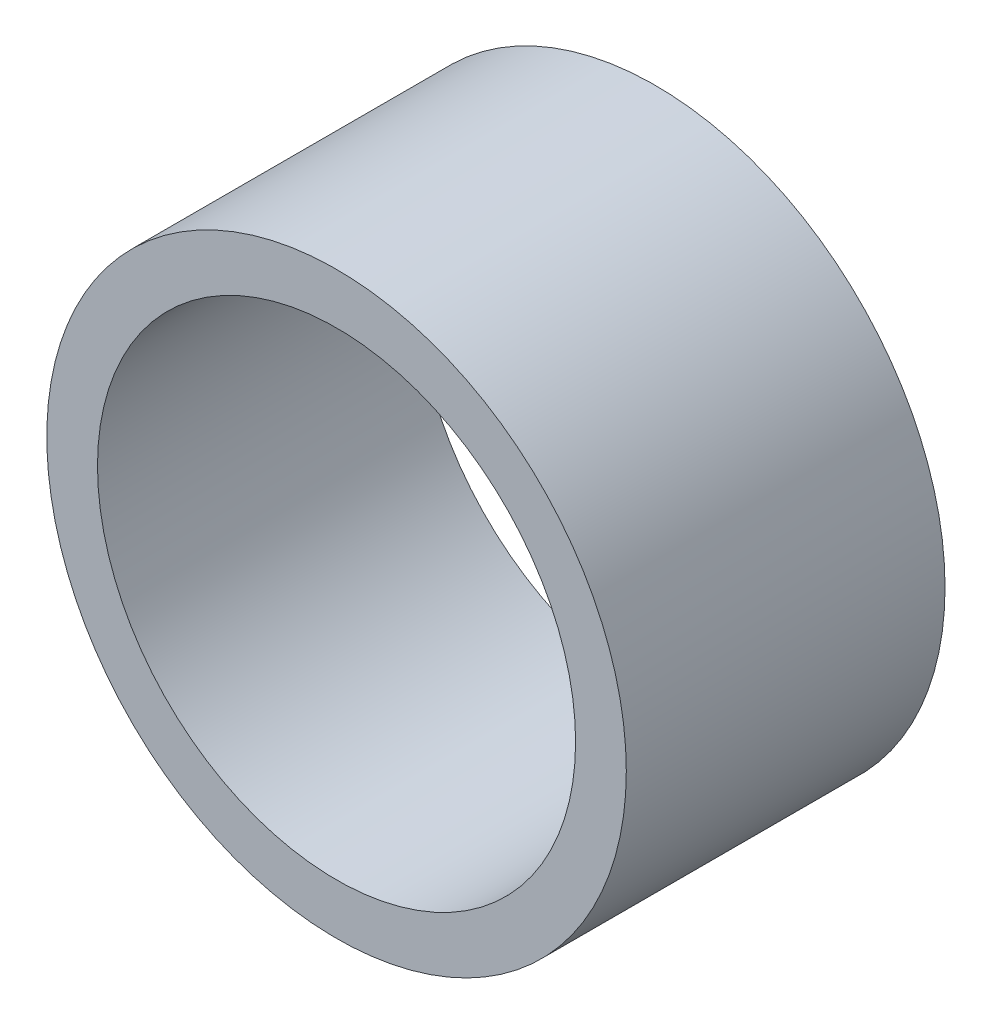
ISO-10303-21;
HEADER;
FILE_DESCRIPTION(('STEP AP214'),'2;1');
FILE_NAME('part.step','',(''),(''),'','','');
FILE_SCHEMA(('AUTOMOTIVE_DESIGN { 1 0 10303 214 1 1 1 1 }'));
ENDSEC;
DATA;
#1=APPLICATION_CONTEXT('core data for automotive mechanical design processes');
#2=APPLICATION_PROTOCOL_DEFINITION('international standard','automotive_design',2000,#1);
#3=PRODUCT_CONTEXT('',#1,'mechanical');
#4=PRODUCT('Part','Part','',(#3));
#5=PRODUCT_RELATED_PRODUCT_CATEGORY('part','',(#4));
#6=PRODUCT_DEFINITION_FORMATION('','',#4);
#7=PRODUCT_DEFINITION_CONTEXT('part definition',#1,'design');
#8=PRODUCT_DEFINITION('design','',#6,#7);
#9=PRODUCT_DEFINITION_SHAPE('','',#8);
#10=(LENGTH_UNIT() NAMED_UNIT(*) SI_UNIT(.MILLI.,.METRE.));
#11=(NAMED_UNIT(*) PLANE_ANGLE_UNIT() SI_UNIT($,.RADIAN.));
#12=(NAMED_UNIT(*) SI_UNIT($,.STERADIAN.) SOLID_ANGLE_UNIT());
#13=UNCERTAINTY_MEASURE_WITH_UNIT(LENGTH_MEASURE(1.E-05),#10,'distance_accuracy_value','');
#14=(GEOMETRIC_REPRESENTATION_CONTEXT(3) GLOBAL_UNCERTAINTY_ASSIGNED_CONTEXT((#13)) GLOBAL_UNIT_ASSIGNED_CONTEXT((#10,
#11,#12)) REPRESENTATION_CONTEXT('',''));
#15=CARTESIAN_POINT('',(0.,0.,0.));
#16=DIRECTION('',(0.,0.,1.));
#17=DIRECTION('',(1.,0.,0.));
#18=AXIS2_PLACEMENT_3D('',#15,#16,#17);
#19=CARTESIAN_POINT('',(-6.34746922024634,-2.91837665298656,3.75));
#20=DIRECTION('',(0.,0.,1.));
#21=DIRECTION('',(1.,0.,0.));
#22=AXIS2_PLACEMENT_3D('',#19,#20,#21);
#23=PLANE('',#22);
#24=CARTESIAN_POINT('',(-6.34746922024634,-2.91837665298656,3.75));
#25=DIRECTION('',(0.,0.,1.));
#26=DIRECTION('',(1.,0.,0.));
#27=AXIS2_PLACEMENT_3D('',#24,#25,#26);
#28=CIRCLE('',#27,20.);
#29=CARTESIAN_POINT('',(13.6525307797537,-2.91837665298656,3.75));
#30=VERTEX_POINT('',#29);
#31=EDGE_CURVE('E10',#30,#30,#28,.T.);
#32=ORIENTED_EDGE('',*,*,#31,.T.);
#33=EDGE_LOOP('',(#32));
#34=FACE_BOUND('',#33,.T.);
#35=CARTESIAN_POINT('',(-6.34746922024634,-2.91837665298656,3.75));
#36=DIRECTION('',(0.,0.,1.));
#37=DIRECTION('',(1.,0.,0.));
#38=AXIS2_PLACEMENT_3D('',#35,#36,#37);
#39=CIRCLE('',#38,16.5000000000001);
#40=CARTESIAN_POINT('',(10.1525307797538,-2.91837665298656,3.75));
#41=VERTEX_POINT('',#40);
#42=EDGE_CURVE('E36',#41,#41,#39,.T.);
#43=ORIENTED_EDGE('',*,*,#42,.F.);
#44=EDGE_LOOP('',(#43));
#45=FACE_BOUND('',#44,.T.);
#46=ADVANCED_FACE('F29',(#34,#45),#23,.T.);
#47=CARTESIAN_POINT('',(-6.34746922024634,-2.91837665298656,3.75));
#48=DIRECTION('',(0.,0.,-1.));
#49=DIRECTION('',(-1.,0.,0.));
#50=AXIS2_PLACEMENT_3D('',#47,#48,#49);
#51=CYLINDRICAL_SURFACE('',#50,20.);
#52=ORIENTED_EDGE('',*,*,#31,.F.);
#53=EDGE_LOOP('',(#52));
#54=FACE_BOUND('',#53,.T.);
#55=CARTESIAN_POINT('',(-6.34746922024634,-2.91837665298656,-18.25));
#56=DIRECTION('',(0.,0.,1.));
#57=DIRECTION('',(1.,0.,0.));
#58=AXIS2_PLACEMENT_3D('',#55,#56,#57);
#59=CIRCLE('',#58,20.);
#60=CARTESIAN_POINT('',(13.6525307797537,-2.91837665298656,-18.25));
#61=VERTEX_POINT('',#60);
#62=EDGE_CURVE('E40',#61,#61,#59,.T.);
#63=ORIENTED_EDGE('',*,*,#62,.T.);
#64=EDGE_LOOP('',(#63));
#65=FACE_BOUND('',#64,.T.);
#66=ADVANCED_FACE('F31',(#54,#65),#51,.T.);
#67=CARTESIAN_POINT('',(-6.34746922024634,-2.91837665298656,3.75));
#68=DIRECTION('',(0.,0.,-1.));
#69=DIRECTION('',(-1.,0.,0.));
#70=AXIS2_PLACEMENT_3D('',#67,#68,#69);
#71=CYLINDRICAL_SURFACE('',#70,16.5000000000001);
#72=ORIENTED_EDGE('',*,*,#42,.T.);
#73=EDGE_LOOP('',(#72));
#74=FACE_BOUND('',#73,.T.);
#75=CARTESIAN_POINT('',(-6.34746922024634,-2.91837665298656,-18.25));
#76=DIRECTION('',(0.,0.,1.));
#77=DIRECTION('',(1.,0.,0.));
#78=AXIS2_PLACEMENT_3D('',#75,#76,#77);
#79=CIRCLE('',#78,16.5000000000001);
#80=CARTESIAN_POINT('',(10.1525307797538,-2.91837665298656,-18.25));
#81=VERTEX_POINT('',#80);
#82=EDGE_CURVE('E44',#81,#81,#79,.T.);
#83=ORIENTED_EDGE('',*,*,#82,.F.);
#84=EDGE_LOOP('',(#83));
#85=FACE_BOUND('',#84,.T.);
#86=ADVANCED_FACE('F53',(#74,#85),#71,.F.);
#87=CARTESIAN_POINT('',(-6.34746922024634,-2.91837665298656,-18.25));
#88=DIRECTION('',(0.,0.,1.));
#89=DIRECTION('',(1.,0.,0.));
#90=AXIS2_PLACEMENT_3D('',#87,#88,#89);
#91=PLANE('',#90);
#92=ORIENTED_EDGE('',*,*,#82,.T.);
#93=EDGE_LOOP('',(#92));
#94=FACE_BOUND('',#93,.T.);
#95=ORIENTED_EDGE('',*,*,#62,.F.);
#96=EDGE_LOOP('',(#95));
#97=FACE_BOUND('',#96,.T.);
#98=ADVANCED_FACE('F50',(#94,#97),#91,.F.);
#99=CLOSED_SHELL('',(#46,#66,#86,#98));
#100=MANIFOLD_SOLID_BREP('B2',#99);
#101=ADVANCED_BREP_SHAPE_REPRESENTATION('',(#18,#100),#14);
#102=SHAPE_DEFINITION_REPRESENTATION(#9,#101);
ENDSEC;
END-ISO-10303-21;
